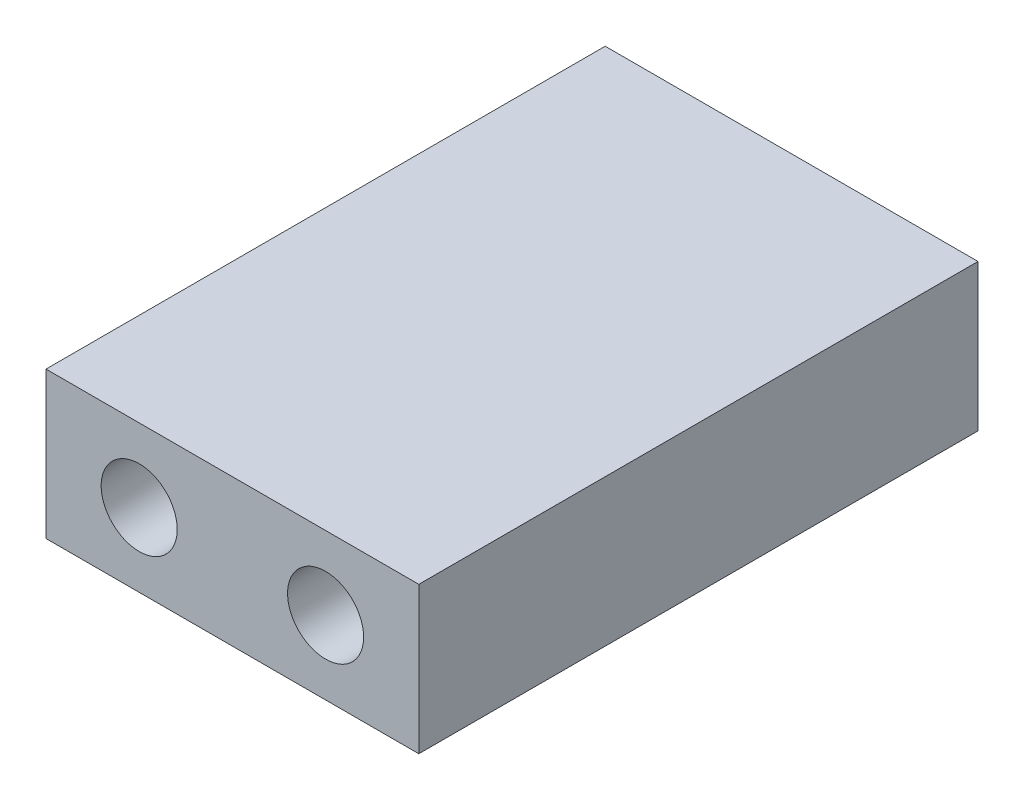
ISO-10303-21;
HEADER;
FILE_DESCRIPTION(('STEP AP214'),'2;1');
FILE_NAME('part.step','',(''),(''),'','','');
FILE_SCHEMA(('AUTOMOTIVE_DESIGN { 1 0 10303 214 1 1 1 1 }'));
ENDSEC;
DATA;
#1=APPLICATION_CONTEXT('core data for automotive mechanical design processes');
#2=APPLICATION_PROTOCOL_DEFINITION('international standard','automotive_design',2000,#1);
#3=PRODUCT_CONTEXT('',#1,'mechanical');
#4=PRODUCT('Part','Part','',(#3));
#5=PRODUCT_RELATED_PRODUCT_CATEGORY('part','',(#4));
#6=PRODUCT_DEFINITION_FORMATION('','',#4);
#7=PRODUCT_DEFINITION_CONTEXT('part definition',#1,'design');
#8=PRODUCT_DEFINITION('design','',#6,#7);
#9=PRODUCT_DEFINITION_SHAPE('','',#8);
#10=(LENGTH_UNIT() NAMED_UNIT(*) SI_UNIT(.MILLI.,.METRE.));
#11=(NAMED_UNIT(*) PLANE_ANGLE_UNIT() SI_UNIT($,.RADIAN.));
#12=(NAMED_UNIT(*) SI_UNIT($,.STERADIAN.) SOLID_ANGLE_UNIT());
#13=UNCERTAINTY_MEASURE_WITH_UNIT(LENGTH_MEASURE(1.E-05),#10,'distance_accuracy_value','');
#14=(GEOMETRIC_REPRESENTATION_CONTEXT(3) GLOBAL_UNCERTAINTY_ASSIGNED_CONTEXT((#13)) GLOBAL_UNIT_ASSIGNED_CONTEXT((#10,
#11,#12)) REPRESENTATION_CONTEXT('',''));
#15=CARTESIAN_POINT('',(0.,0.,0.));
#16=DIRECTION('',(0.,0.,1.));
#17=DIRECTION('',(1.,0.,0.));
#18=AXIS2_PLACEMENT_3D('',#15,#16,#17);
#19=CARTESIAN_POINT('',(0.,0.,38.1));
#20=DIRECTION('',(0.,0.,-1.));
#21=DIRECTION('',(-1.,0.,0.));
#22=AXIS2_PLACEMENT_3D('',#19,#20,#21);
#23=PLANE('',#22);
#24=CARTESIAN_POINT('',(6.35,5.,38.1));
#25=DIRECTION('',(0.,0.,1.));
#26=DIRECTION('',(1.,0.,0.));
#27=AXIS2_PLACEMENT_3D('',#24,#25,#26);
#28=CIRCLE('',#27,2.5908);
#29=CARTESIAN_POINT('',(8.9408,5.,38.1));
#30=VERTEX_POINT('',#29);
#31=EDGE_CURVE('E138',#30,#30,#28,.T.);
#32=ORIENTED_EDGE('',*,*,#31,.F.);
#33=EDGE_LOOP('',(#32));
#34=FACE_BOUND('',#33,.T.);
#35=DIRECTION('',(0.,-1.,0.));
#36=VECTOR('',#35,1.);
#37=CARTESIAN_POINT('',(0.,0.,38.1));
#38=LINE('',#37,#36);
#39=CARTESIAN_POINT('',(0.,10.,38.1));
#40=VERTEX_POINT('',#39);
#41=CARTESIAN_POINT('',(0.,0.,38.1));
#42=VERTEX_POINT('',#41);
#43=EDGE_CURVE('E98',#40,#42,#38,.T.);
#44=ORIENTED_EDGE('',*,*,#43,.T.);
#45=DIRECTION('',(1.,0.,0.));
#46=VECTOR('',#45,1.);
#47=CARTESIAN_POINT('',(0.,0.,38.1));
#48=LINE('',#47,#46);
#49=CARTESIAN_POINT('',(25.4,0.,38.1));
#50=VERTEX_POINT('',#49);
#51=EDGE_CURVE('E93',#42,#50,#48,.T.);
#52=ORIENTED_EDGE('',*,*,#51,.T.);
#53=DIRECTION('',(0.,1.,0.));
#54=VECTOR('',#53,1.);
#55=CARTESIAN_POINT('',(25.4,0.,38.1));
#56=LINE('',#55,#54);
#57=CARTESIAN_POINT('',(25.4,10.,38.1));
#58=VERTEX_POINT('',#57);
#59=EDGE_CURVE('E96',#50,#58,#56,.T.);
#60=ORIENTED_EDGE('',*,*,#59,.T.);
#61=DIRECTION('',(-1.,0.,0.));
#62=VECTOR('',#61,1.);
#63=CARTESIAN_POINT('',(0.,10.,38.1));
#64=LINE('',#63,#62);
#65=EDGE_CURVE('E63',#58,#40,#64,.T.);
#66=ORIENTED_EDGE('',*,*,#65,.T.);
#67=EDGE_LOOP('',(#44,#52,#60,#66));
#68=FACE_BOUND('',#67,.T.);
#69=CARTESIAN_POINT('',(19.05,5.,38.1));
#70=DIRECTION('',(0.,0.,1.));
#71=DIRECTION('',(1.,0.,0.));
#72=AXIS2_PLACEMENT_3D('',#69,#70,#71);
#73=CIRCLE('',#72,2.5908);
#74=CARTESIAN_POINT('',(21.6408,5.,38.1));
#75=VERTEX_POINT('',#74);
#76=EDGE_CURVE('E146',#75,#75,#73,.T.);
#77=ORIENTED_EDGE('',*,*,#76,.F.);
#78=EDGE_LOOP('',(#77));
#79=FACE_BOUND('',#78,.T.);
#80=ADVANCED_FACE('F45',(#34,#68,#79),#23,.F.);
#81=CARTESIAN_POINT('',(0.,0.,38.1));
#82=DIRECTION('',(1.,0.,0.));
#83=DIRECTION('',(0.,0.,-1.));
#84=AXIS2_PLACEMENT_3D('',#81,#82,#83);
#85=PLANE('',#84);
#86=DIRECTION('',(0.,-1.,0.));
#87=VECTOR('',#86,1.);
#88=CARTESIAN_POINT('',(0.,0.,0.));
#89=LINE('',#88,#87);
#90=CARTESIAN_POINT('',(0.,10.,0.));
#91=VERTEX_POINT('',#90);
#92=CARTESIAN_POINT('',(0.,0.,0.));
#93=VERTEX_POINT('',#92);
#94=EDGE_CURVE('E114',#91,#93,#89,.T.);
#95=ORIENTED_EDGE('',*,*,#94,.T.);
#96=DIRECTION('',(0.,0.,-1.));
#97=VECTOR('',#96,1.);
#98=CARTESIAN_POINT('',(0.,0.,38.1));
#99=LINE('',#98,#97);
#100=EDGE_CURVE('E11',#42,#93,#99,.T.);
#101=ORIENTED_EDGE('',*,*,#100,.F.);
#102=ORIENTED_EDGE('',*,*,#43,.F.);
#103=DIRECTION('',(0.,0.,-1.));
#104=VECTOR('',#103,1.);
#105=CARTESIAN_POINT('',(0.,10.,38.1));
#106=LINE('',#105,#104);
#107=EDGE_CURVE('E110',#40,#91,#106,.T.);
#108=ORIENTED_EDGE('',*,*,#107,.T.);
#109=EDGE_LOOP('',(#95,#101,#102,#108));
#110=FACE_BOUND('',#109,.T.);
#111=ADVANCED_FACE('F47',(#110),#85,.F.);
#112=CARTESIAN_POINT('',(0.,0.,38.1));
#113=DIRECTION('',(0.,1.,0.));
#114=DIRECTION('',(0.,0.,1.));
#115=AXIS2_PLACEMENT_3D('',#112,#113,#114);
#116=PLANE('',#115);
#117=DIRECTION('',(1.,0.,0.));
#118=VECTOR('',#117,1.);
#119=CARTESIAN_POINT('',(0.,0.,0.));
#120=LINE('',#119,#118);
#121=CARTESIAN_POINT('',(25.4,0.,0.));
#122=VERTEX_POINT('',#121);
#123=EDGE_CURVE('E103',#93,#122,#120,.T.);
#124=ORIENTED_EDGE('',*,*,#123,.T.);
#125=DIRECTION('',(0.,0.,-1.));
#126=VECTOR('',#125,1.);
#127=CARTESIAN_POINT('',(25.4,0.,38.1));
#128=LINE('',#127,#126);
#129=EDGE_CURVE('E55',#50,#122,#128,.T.);
#130=ORIENTED_EDGE('',*,*,#129,.F.);
#131=ORIENTED_EDGE('',*,*,#51,.F.);
#132=ORIENTED_EDGE('',*,*,#100,.T.);
#133=EDGE_LOOP('',(#124,#130,#131,#132));
#134=FACE_BOUND('',#133,.T.);
#135=ADVANCED_FACE('F102',(#134),#116,.F.);
#136=CARTESIAN_POINT('',(25.4,0.,38.1));
#137=DIRECTION('',(-1.,0.,0.));
#138=DIRECTION('',(0.,0.,1.));
#139=AXIS2_PLACEMENT_3D('',#136,#137,#138);
#140=PLANE('',#139);
#141=DIRECTION('',(0.,1.,0.));
#142=VECTOR('',#141,1.);
#143=CARTESIAN_POINT('',(25.4,0.,0.));
#144=LINE('',#143,#142);
#145=CARTESIAN_POINT('',(25.4,10.,0.));
#146=VERTEX_POINT('',#145);
#147=EDGE_CURVE('E80',#122,#146,#144,.T.);
#148=ORIENTED_EDGE('',*,*,#147,.T.);
#149=DIRECTION('',(0.,0.,-1.));
#150=VECTOR('',#149,1.);
#151=CARTESIAN_POINT('',(25.4,10.,38.1));
#152=LINE('',#151,#150);
#153=EDGE_CURVE('E105',#58,#146,#152,.T.);
#154=ORIENTED_EDGE('',*,*,#153,.F.);
#155=ORIENTED_EDGE('',*,*,#59,.F.);
#156=ORIENTED_EDGE('',*,*,#129,.T.);
#157=EDGE_LOOP('',(#148,#154,#155,#156));
#158=FACE_BOUND('',#157,.T.);
#159=ADVANCED_FACE('F106',(#158),#140,.F.);
#160=CARTESIAN_POINT('',(0.,10.,38.1));
#161=DIRECTION('',(0.,-1.,0.));
#162=DIRECTION('',(0.,0.,-1.));
#163=AXIS2_PLACEMENT_3D('',#160,#161,#162);
#164=PLANE('',#163);
#165=DIRECTION('',(-1.,0.,0.));
#166=VECTOR('',#165,1.);
#167=CARTESIAN_POINT('',(0.,10.,0.));
#168=LINE('',#167,#166);
#169=EDGE_CURVE('E86',#146,#91,#168,.T.);
#170=ORIENTED_EDGE('',*,*,#169,.T.);
#171=ORIENTED_EDGE('',*,*,#107,.F.);
#172=ORIENTED_EDGE('',*,*,#65,.F.);
#173=ORIENTED_EDGE('',*,*,#153,.T.);
#174=EDGE_LOOP('',(#170,#171,#172,#173));
#175=FACE_BOUND('',#174,.T.);
#176=ADVANCED_FACE('F128',(#175),#164,.F.);
#177=CARTESIAN_POINT('',(0.,0.,0.));
#178=DIRECTION('',(0.,0.,-1.));
#179=DIRECTION('',(-1.,0.,0.));
#180=AXIS2_PLACEMENT_3D('',#177,#178,#179);
#181=PLANE('',#180);
#182=CARTESIAN_POINT('',(19.05,5.,0.));
#183=DIRECTION('',(0.,0.,1.));
#184=DIRECTION('',(1.,0.,0.));
#185=AXIS2_PLACEMENT_3D('',#182,#183,#184);
#186=CIRCLE('',#185,2.59079999999999);
#187=CARTESIAN_POINT('',(21.6408,5.,0.));
#188=VERTEX_POINT('',#187);
#189=EDGE_CURVE('E142',#188,#188,#186,.T.);
#190=ORIENTED_EDGE('',*,*,#189,.T.);
#191=EDGE_LOOP('',(#190));
#192=FACE_BOUND('',#191,.T.);
#193=CARTESIAN_POINT('',(6.35,5.,0.));
#194=DIRECTION('',(0.,0.,1.));
#195=DIRECTION('',(1.,0.,0.));
#196=AXIS2_PLACEMENT_3D('',#193,#194,#195);
#197=CIRCLE('',#196,2.59079999999999);
#198=CARTESIAN_POINT('',(8.94079999999999,5.,0.));
#199=VERTEX_POINT('',#198);
#200=EDGE_CURVE('E118',#199,#199,#197,.T.);
#201=ORIENTED_EDGE('',*,*,#200,.T.);
#202=EDGE_LOOP('',(#201));
#203=FACE_BOUND('',#202,.T.);
#204=ORIENTED_EDGE('',*,*,#94,.F.);
#205=ORIENTED_EDGE('',*,*,#169,.F.);
#206=ORIENTED_EDGE('',*,*,#147,.F.);
#207=ORIENTED_EDGE('',*,*,#123,.F.);
#208=EDGE_LOOP('',(#204,#205,#206,#207));
#209=FACE_BOUND('',#208,.T.);
#210=ADVANCED_FACE('F131',(#192,#203,#209),#181,.T.);
#211=CARTESIAN_POINT('',(6.35,5.,38.1));
#212=DIRECTION('',(0.,0.,1.));
#213=DIRECTION('',(1.,0.,0.));
#214=AXIS2_PLACEMENT_3D('',#211,#212,#213);
#215=CYLINDRICAL_SURFACE('',#214,2.59079999999999);
#216=ORIENTED_EDGE('',*,*,#200,.F.);
#217=EDGE_LOOP('',(#216));
#218=FACE_BOUND('',#217,.T.);
#219=ORIENTED_EDGE('',*,*,#31,.T.);
#220=EDGE_LOOP('',(#219));
#221=FACE_BOUND('',#220,.T.);
#222=ADVANCED_FACE('F163',(#218,#221),#215,.F.);
#223=CARTESIAN_POINT('',(19.05,5.,38.1));
#224=DIRECTION('',(0.,0.,1.));
#225=DIRECTION('',(1.,0.,0.));
#226=AXIS2_PLACEMENT_3D('',#223,#224,#225);
#227=CYLINDRICAL_SURFACE('',#226,2.59079999999999);
#228=ORIENTED_EDGE('',*,*,#189,.F.);
#229=EDGE_LOOP('',(#228));
#230=FACE_BOUND('',#229,.T.);
#231=ORIENTED_EDGE('',*,*,#76,.T.);
#232=EDGE_LOOP('',(#231));
#233=FACE_BOUND('',#232,.T.);
#234=ADVANCED_FACE('F151',(#230,#233),#227,.F.);
#235=CLOSED_SHELL('',(#80,#111,#135,#159,#176,#210,#222,#234));
#236=MANIFOLD_SOLID_BREP('B2',#235);
#237=ADVANCED_BREP_SHAPE_REPRESENTATION('',(#18,#236),#14);
#238=SHAPE_DEFINITION_REPRESENTATION(#9,#237);
ENDSEC;
END-ISO-10303-21;
